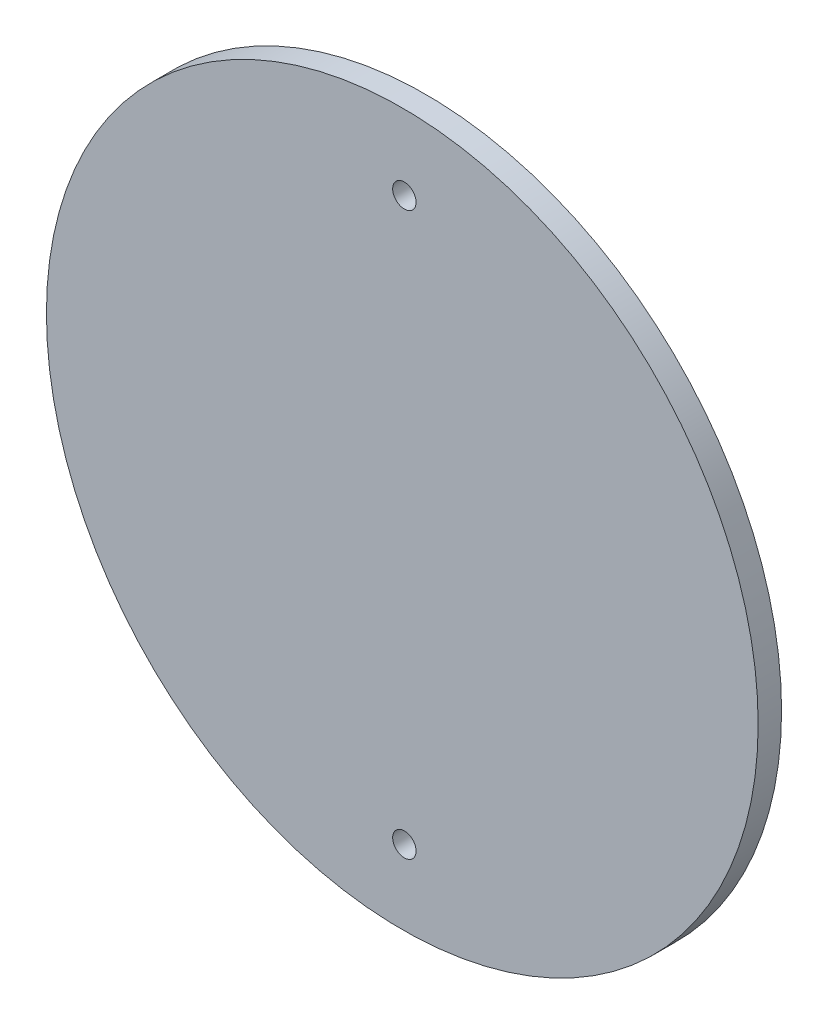
ISO-10303-21;
HEADER;
FILE_DESCRIPTION(('STEP AP214'),'2;1');
FILE_NAME('part.step','',(''),(''),'','','');
FILE_SCHEMA(('AUTOMOTIVE_DESIGN { 1 0 10303 214 1 1 1 1 }'));
ENDSEC;
DATA;
#1=APPLICATION_CONTEXT('core data for automotive mechanical design processes');
#2=APPLICATION_PROTOCOL_DEFINITION('international standard','automotive_design',2000,#1);
#3=PRODUCT_CONTEXT('',#1,'mechanical');
#4=PRODUCT('Part','Part','',(#3));
#5=PRODUCT_RELATED_PRODUCT_CATEGORY('part','',(#4));
#6=PRODUCT_DEFINITION_FORMATION('','',#4);
#7=PRODUCT_DEFINITION_CONTEXT('part definition',#1,'design');
#8=PRODUCT_DEFINITION('design','',#6,#7);
#9=PRODUCT_DEFINITION_SHAPE('','',#8);
#10=(LENGTH_UNIT() NAMED_UNIT(*) SI_UNIT(.MILLI.,.METRE.));
#11=(NAMED_UNIT(*) PLANE_ANGLE_UNIT() SI_UNIT($,.RADIAN.));
#12=(NAMED_UNIT(*) SI_UNIT($,.STERADIAN.) SOLID_ANGLE_UNIT());
#13=UNCERTAINTY_MEASURE_WITH_UNIT(LENGTH_MEASURE(1.E-05),#10,'distance_accuracy_value','');
#14=(GEOMETRIC_REPRESENTATION_CONTEXT(3) GLOBAL_UNCERTAINTY_ASSIGNED_CONTEXT((#13)) GLOBAL_UNIT_ASSIGNED_CONTEXT((#10,
#11,#12)) REPRESENTATION_CONTEXT('',''));
#15=CARTESIAN_POINT('',(0.,0.,0.));
#16=DIRECTION('',(0.,0.,1.));
#17=DIRECTION('',(1.,0.,0.));
#18=AXIS2_PLACEMENT_3D('',#15,#16,#17);
#19=CARTESIAN_POINT('',(-94.397031795319,74.7050107082677,5.));
#20=DIRECTION('',(0.,0.,-1.));
#21=DIRECTION('',(-1.,0.,0.));
#22=AXIS2_PLACEMENT_3D('',#19,#20,#21);
#23=CYLINDRICAL_SURFACE('',#22,76.);
#24=CARTESIAN_POINT('',(-94.397031795319,74.7050107082677,5.));
#25=DIRECTION('',(0.,0.,1.));
#26=DIRECTION('',(1.,0.,0.));
#27=AXIS2_PLACEMENT_3D('',#24,#25,#26);
#28=CIRCLE('',#27,76.);
#29=CARTESIAN_POINT('',(-18.397031795319,74.7050107082677,5.));
#30=VERTEX_POINT('',#29);
#31=EDGE_CURVE('E10',#30,#30,#28,.T.);
#32=ORIENTED_EDGE('',*,*,#31,.F.);
#33=EDGE_LOOP('',(#32));
#34=FACE_BOUND('',#33,.T.);
#35=CARTESIAN_POINT('',(-94.397031795319,74.7050107082677,0.));
#36=DIRECTION('',(0.,0.,1.));
#37=DIRECTION('',(1.,0.,0.));
#38=AXIS2_PLACEMENT_3D('',#35,#36,#37);
#39=CIRCLE('',#38,76.);
#40=CARTESIAN_POINT('',(-18.397031795319,74.7050107082677,0.));
#41=VERTEX_POINT('',#40);
#42=EDGE_CURVE('E38',#41,#41,#39,.T.);
#43=ORIENTED_EDGE('',*,*,#42,.T.);
#44=EDGE_LOOP('',(#43));
#45=FACE_BOUND('',#44,.T.);
#46=ADVANCED_FACE('F31',(#34,#45),#23,.T.);
#47=CARTESIAN_POINT('',(-94.397031795319,74.7050107082677,5.));
#48=DIRECTION('',(0.,0.,1.));
#49=DIRECTION('',(1.,0.,0.));
#50=AXIS2_PLACEMENT_3D('',#47,#48,#49);
#51=PLANE('',#50);
#52=CARTESIAN_POINT('',(-93.9533952640978,134.705010708268,5.));
#53=DIRECTION('',(0.,0.,1.));
#54=DIRECTION('',(1.,0.,0.));
#55=AXIS2_PLACEMENT_3D('',#52,#53,#54);
#56=CIRCLE('',#55,2.5);
#57=CARTESIAN_POINT('',(-91.4533952640978,134.705010708268,5.));
#58=VERTEX_POINT('',#57);
#59=EDGE_CURVE('E49',#58,#58,#56,.T.);
#60=ORIENTED_EDGE('',*,*,#59,.F.);
#61=EDGE_LOOP('',(#60));
#62=FACE_BOUND('',#61,.T.);
#63=CARTESIAN_POINT('',(-93.9533952640978,14.7050107082677,5.));
#64=DIRECTION('',(0.,0.,1.));
#65=DIRECTION('',(1.,0.,0.));
#66=AXIS2_PLACEMENT_3D('',#63,#64,#65);
#67=CIRCLE('',#66,2.5);
#68=CARTESIAN_POINT('',(-91.4533952640978,14.7050107082677,5.));
#69=VERTEX_POINT('',#68);
#70=EDGE_CURVE('E45',#69,#69,#67,.T.);
#71=ORIENTED_EDGE('',*,*,#70,.F.);
#72=EDGE_LOOP('',(#71));
#73=FACE_BOUND('',#72,.T.);
#74=ORIENTED_EDGE('',*,*,#31,.T.);
#75=EDGE_LOOP('',(#74));
#76=FACE_BOUND('',#75,.T.);
#77=ADVANCED_FACE('F62',(#62,#73,#76),#51,.T.);
#78=CARTESIAN_POINT('',(-94.397031795319,74.7050107082677,0.));
#79=DIRECTION('',(0.,0.,1.));
#80=DIRECTION('',(1.,0.,0.));
#81=AXIS2_PLACEMENT_3D('',#78,#79,#80);
#82=PLANE('',#81);
#83=CARTESIAN_POINT('',(-93.9533952640978,134.705010708268,0.));
#84=DIRECTION('',(0.,0.,1.));
#85=DIRECTION('',(1.,0.,0.));
#86=AXIS2_PLACEMENT_3D('',#83,#84,#85);
#87=CIRCLE('',#86,2.5);
#88=CARTESIAN_POINT('',(-91.4533952640978,134.705010708268,0.));
#89=VERTEX_POINT('',#88);
#90=EDGE_CURVE('E34',#89,#89,#87,.T.);
#91=ORIENTED_EDGE('',*,*,#90,.T.);
#92=EDGE_LOOP('',(#91));
#93=FACE_BOUND('',#92,.T.);
#94=CARTESIAN_POINT('',(-93.9533952640978,14.7050107082677,0.));
#95=DIRECTION('',(0.,0.,1.));
#96=DIRECTION('',(1.,0.,0.));
#97=AXIS2_PLACEMENT_3D('',#94,#95,#96);
#98=CIRCLE('',#97,2.5);
#99=CARTESIAN_POINT('',(-91.4533952640978,14.7050107082677,0.));
#100=VERTEX_POINT('',#99);
#101=EDGE_CURVE('E47',#100,#100,#98,.T.);
#102=ORIENTED_EDGE('',*,*,#101,.T.);
#103=EDGE_LOOP('',(#102));
#104=FACE_BOUND('',#103,.T.);
#105=ORIENTED_EDGE('',*,*,#42,.F.);
#106=EDGE_LOOP('',(#105));
#107=FACE_BOUND('',#106,.T.);
#108=ADVANCED_FACE('F64',(#93,#104,#107),#82,.F.);
#109=CARTESIAN_POINT('',(-93.9533952640978,14.7050107082677,-5.));
#110=DIRECTION('',(0.,0.,1.));
#111=DIRECTION('',(1.,0.,0.));
#112=AXIS2_PLACEMENT_3D('',#109,#110,#111);
#113=CYLINDRICAL_SURFACE('',#112,2.5);
#114=ORIENTED_EDGE('',*,*,#70,.T.);
#115=EDGE_LOOP('',(#114));
#116=FACE_BOUND('',#115,.T.);
#117=ORIENTED_EDGE('',*,*,#101,.F.);
#118=EDGE_LOOP('',(#117));
#119=FACE_BOUND('',#118,.T.);
#120=ADVANCED_FACE('F59',(#116,#119),#113,.F.);
#121=CARTESIAN_POINT('',(-93.9533952640978,134.705010708268,-5.));
#122=DIRECTION('',(0.,0.,1.));
#123=DIRECTION('',(1.,0.,0.));
#124=AXIS2_PLACEMENT_3D('',#121,#122,#123);
#125=CYLINDRICAL_SURFACE('',#124,2.5);
#126=ORIENTED_EDGE('',*,*,#59,.T.);
#127=EDGE_LOOP('',(#126));
#128=FACE_BOUND('',#127,.T.);
#129=ORIENTED_EDGE('',*,*,#90,.F.);
#130=EDGE_LOOP('',(#129));
#131=FACE_BOUND('',#130,.T.);
#132=ADVANCED_FACE('F76',(#128,#131),#125,.F.);
#133=CLOSED_SHELL('',(#46,#77,#108,#120,#132));
#134=MANIFOLD_SOLID_BREP('B2',#133);
#135=ADVANCED_BREP_SHAPE_REPRESENTATION('',(#18,#134),#14);
#136=SHAPE_DEFINITION_REPRESENTATION(#9,#135);
ENDSEC;
END-ISO-10303-21;
